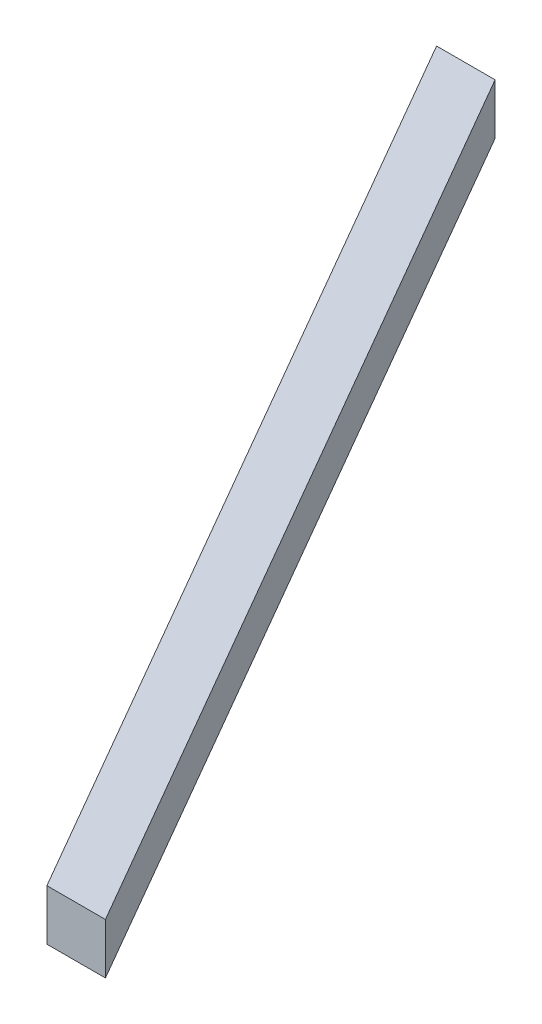
ISO-10303-21;
HEADER;
FILE_DESCRIPTION(('STEP AP214'),'2;1');
FILE_NAME('part.step','',(''),(''),'','','');
FILE_SCHEMA(('AUTOMOTIVE_DESIGN { 1 0 10303 214 1 1 1 1 }'));
ENDSEC;
DATA;
#1=APPLICATION_CONTEXT('core data for automotive mechanical design processes');
#2=APPLICATION_PROTOCOL_DEFINITION('international standard','automotive_design',2000,#1);
#3=PRODUCT_CONTEXT('',#1,'mechanical');
#4=PRODUCT('Part','Part','',(#3));
#5=PRODUCT_RELATED_PRODUCT_CATEGORY('part','',(#4));
#6=PRODUCT_DEFINITION_FORMATION('','',#4);
#7=PRODUCT_DEFINITION_CONTEXT('part definition',#1,'design');
#8=PRODUCT_DEFINITION('design','',#6,#7);
#9=PRODUCT_DEFINITION_SHAPE('','',#8);
#10=(LENGTH_UNIT() NAMED_UNIT(*) SI_UNIT(.MILLI.,.METRE.));
#11=(NAMED_UNIT(*) PLANE_ANGLE_UNIT() SI_UNIT($,.RADIAN.));
#12=(NAMED_UNIT(*) SI_UNIT($,.STERADIAN.) SOLID_ANGLE_UNIT());
#13=UNCERTAINTY_MEASURE_WITH_UNIT(LENGTH_MEASURE(1.E-05),#10,'distance_accuracy_value','');
#14=(GEOMETRIC_REPRESENTATION_CONTEXT(3) GLOBAL_UNCERTAINTY_ASSIGNED_CONTEXT((#13)) GLOBAL_UNIT_ASSIGNED_CONTEXT((#10,
#11,#12)) REPRESENTATION_CONTEXT('',''));
#15=CARTESIAN_POINT('',(0.,0.,0.));
#16=DIRECTION('',(0.,0.,1.));
#17=DIRECTION('',(1.,0.,0.));
#18=AXIS2_PLACEMENT_3D('',#15,#16,#17);
#19=CARTESIAN_POINT('',(270.,20.,200.));
#20=DIRECTION('',(0.,0.,-1.));
#21=DIRECTION('',(-1.,0.,0.));
#22=AXIS2_PLACEMENT_3D('',#19,#20,#21);
#23=PLANE('',#22);
#24=DIRECTION('',(1.,0.,0.));
#25=VECTOR('',#24,1.);
#26=CARTESIAN_POINT('',(270.,0.,200.));
#27=LINE('',#26,#25);
#28=CARTESIAN_POINT('',(270.,0.,200.));
#29=VERTEX_POINT('',#28);
#30=CARTESIAN_POINT('',(293.094010767585,0.,200.));
#31=VERTEX_POINT('',#30);
#32=EDGE_CURVE('E110',#29,#31,#27,.T.);
#33=ORIENTED_EDGE('',*,*,#32,.F.);
#34=DIRECTION('',(0.,-1.,0.));
#35=VECTOR('',#34,1.);
#36=CARTESIAN_POINT('',(270.,20.,200.));
#37=LINE('',#36,#35);
#38=CARTESIAN_POINT('',(270.,20.,200.));
#39=VERTEX_POINT('',#38);
#40=EDGE_CURVE('E11',#39,#29,#37,.T.);
#41=ORIENTED_EDGE('',*,*,#40,.F.);
#42=DIRECTION('',(1.,0.,0.));
#43=VECTOR('',#42,1.);
#44=CARTESIAN_POINT('',(270.,20.,200.));
#45=LINE('',#44,#43);
#46=CARTESIAN_POINT('',(293.094010767585,20.,200.));
#47=VERTEX_POINT('',#46);
#48=EDGE_CURVE('E103',#39,#47,#45,.T.);
#49=ORIENTED_EDGE('',*,*,#48,.T.);
#50=DIRECTION('',(0.,-1.,0.));
#51=VECTOR('',#50,1.);
#52=CARTESIAN_POINT('',(293.094010767585,20.,200.));
#53=LINE('',#52,#51);
#54=EDGE_CURVE('E42',#47,#31,#53,.T.);
#55=ORIENTED_EDGE('',*,*,#54,.T.);
#56=EDGE_LOOP('',(#33,#41,#49,#55));
#57=FACE_BOUND('',#56,.T.);
#58=ADVANCED_FACE('F39',(#57),#23,.T.);
#59=CARTESIAN_POINT('',(270.,20.,200.));
#60=DIRECTION('',(0.866025403784436,0.,-0.500000000000004));
#61=DIRECTION('',(-0.500000000000004,0.,-0.866025403784436));
#62=AXIS2_PLACEMENT_3D('',#59,#60,#61);
#63=PLANE('',#62);
#64=DIRECTION('',(0.500000000000004,0.,0.866025403784436));
#65=VECTOR('',#64,1.);
#66=CARTESIAN_POINT('',(270.,0.,200.));
#67=LINE('',#66,#65);
#68=CARTESIAN_POINT('',(480.000000000002,0.,563.730669589463));
#69=VERTEX_POINT('',#68);
#70=EDGE_CURVE('E73',#29,#69,#67,.T.);
#71=ORIENTED_EDGE('',*,*,#70,.T.);
#72=DIRECTION('',(0.,-1.,0.));
#73=VECTOR('',#72,1.);
#74=CARTESIAN_POINT('',(480.000000000002,20.,563.730669589463));
#75=LINE('',#74,#73);
#76=CARTESIAN_POINT('',(480.000000000002,20.,563.730669589463));
#77=VERTEX_POINT('',#76);
#78=EDGE_CURVE('E49',#77,#69,#75,.T.);
#79=ORIENTED_EDGE('',*,*,#78,.F.);
#80=DIRECTION('',(0.500000000000004,0.,0.866025403784436));
#81=VECTOR('',#80,1.);
#82=CARTESIAN_POINT('',(270.,20.,200.));
#83=LINE('',#82,#81);
#84=EDGE_CURVE('E88',#39,#77,#83,.T.);
#85=ORIENTED_EDGE('',*,*,#84,.F.);
#86=ORIENTED_EDGE('',*,*,#40,.T.);
#87=EDGE_LOOP('',(#71,#79,#85,#86));
#88=FACE_BOUND('',#87,.T.);
#89=ADVANCED_FACE('F126',(#88),#63,.F.);
#90=CARTESIAN_POINT('',(480.000000000002,20.,563.730669589463));
#91=DIRECTION('',(0.,0.,-1.));
#92=DIRECTION('',(-1.,0.,0.));
#93=AXIS2_PLACEMENT_3D('',#90,#91,#92);
#94=PLANE('',#93);
#95=DIRECTION('',(1.,0.,0.));
#96=VECTOR('',#95,1.);
#97=CARTESIAN_POINT('',(480.000000000002,0.,563.730669589463));
#98=LINE('',#97,#96);
#99=CARTESIAN_POINT('',(503.094010767587,0.,563.730669589463));
#100=VERTEX_POINT('',#99);
#101=EDGE_CURVE('E96',#69,#100,#98,.T.);
#102=ORIENTED_EDGE('',*,*,#101,.T.);
#103=DIRECTION('',(0.,-1.,0.));
#104=VECTOR('',#103,1.);
#105=CARTESIAN_POINT('',(503.094010767587,20.,563.730669589463));
#106=LINE('',#105,#104);
#107=CARTESIAN_POINT('',(503.094010767587,20.,563.730669589463));
#108=VERTEX_POINT('',#107);
#109=EDGE_CURVE('E93',#108,#100,#106,.T.);
#110=ORIENTED_EDGE('',*,*,#109,.F.);
#111=DIRECTION('',(1.,0.,0.));
#112=VECTOR('',#111,1.);
#113=CARTESIAN_POINT('',(480.000000000002,20.,563.730669589463));
#114=LINE('',#113,#112);
#115=EDGE_CURVE('E85',#77,#108,#114,.T.);
#116=ORIENTED_EDGE('',*,*,#115,.F.);
#117=ORIENTED_EDGE('',*,*,#78,.T.);
#118=EDGE_LOOP('',(#102,#110,#116,#117));
#119=FACE_BOUND('',#118,.T.);
#120=ADVANCED_FACE('F94',(#119),#94,.F.);
#121=CARTESIAN_POINT('',(503.094010767587,20.,563.730669589463));
#122=DIRECTION('',(-0.866025403784436,0.,0.500000000000004));
#123=DIRECTION('',(0.500000000000004,0.,0.866025403784436));
#124=AXIS2_PLACEMENT_3D('',#121,#122,#123);
#125=PLANE('',#124);
#126=DIRECTION('',(-0.500000000000004,0.,-0.866025403784436));
#127=VECTOR('',#126,1.);
#128=CARTESIAN_POINT('',(503.094010767587,0.,563.730669589463));
#129=LINE('',#128,#127);
#130=EDGE_CURVE('E114',#100,#31,#129,.T.);
#131=ORIENTED_EDGE('',*,*,#130,.T.);
#132=ORIENTED_EDGE('',*,*,#54,.F.);
#133=DIRECTION('',(-0.500000000000004,0.,-0.866025403784436));
#134=VECTOR('',#133,1.);
#135=CARTESIAN_POINT('',(503.094010767587,20.,563.730669589463));
#136=LINE('',#135,#134);
#137=EDGE_CURVE('E82',#108,#47,#136,.T.);
#138=ORIENTED_EDGE('',*,*,#137,.F.);
#139=ORIENTED_EDGE('',*,*,#109,.T.);
#140=EDGE_LOOP('',(#131,#132,#138,#139));
#141=FACE_BOUND('',#140,.T.);
#142=ADVANCED_FACE('F101',(#141),#125,.F.);
#143=CARTESIAN_POINT('',(0.,20.,0.));
#144=DIRECTION('',(0.,1.,0.));
#145=DIRECTION('',(0.,0.,1.));
#146=AXIS2_PLACEMENT_3D('',#143,#144,#145);
#147=PLANE('',#146);
#148=ORIENTED_EDGE('',*,*,#48,.F.);
#149=ORIENTED_EDGE('',*,*,#84,.T.);
#150=ORIENTED_EDGE('',*,*,#115,.T.);
#151=ORIENTED_EDGE('',*,*,#137,.T.);
#152=EDGE_LOOP('',(#148,#149,#150,#151));
#153=FACE_BOUND('',#152,.T.);
#154=ADVANCED_FACE('F87',(#153),#147,.T.);
#155=CARTESIAN_POINT('',(0.,0.,0.));
#156=DIRECTION('',(0.,1.,0.));
#157=DIRECTION('',(0.,0.,1.));
#158=AXIS2_PLACEMENT_3D('',#155,#156,#157);
#159=PLANE('',#158);
#160=ORIENTED_EDGE('',*,*,#32,.T.);
#161=ORIENTED_EDGE('',*,*,#130,.F.);
#162=ORIENTED_EDGE('',*,*,#101,.F.);
#163=ORIENTED_EDGE('',*,*,#70,.F.);
#164=EDGE_LOOP('',(#160,#161,#162,#163));
#165=FACE_BOUND('',#164,.T.);
#166=ADVANCED_FACE('F123',(#165),#159,.F.);
#167=CLOSED_SHELL('',(#58,#89,#120,#142,#154,#166));
#168=MANIFOLD_SOLID_BREP('B2',#167);
#169=ADVANCED_BREP_SHAPE_REPRESENTATION('',(#18,#168),#14);
#170=SHAPE_DEFINITION_REPRESENTATION(#9,#169);
ENDSEC;
END-ISO-10303-21;
